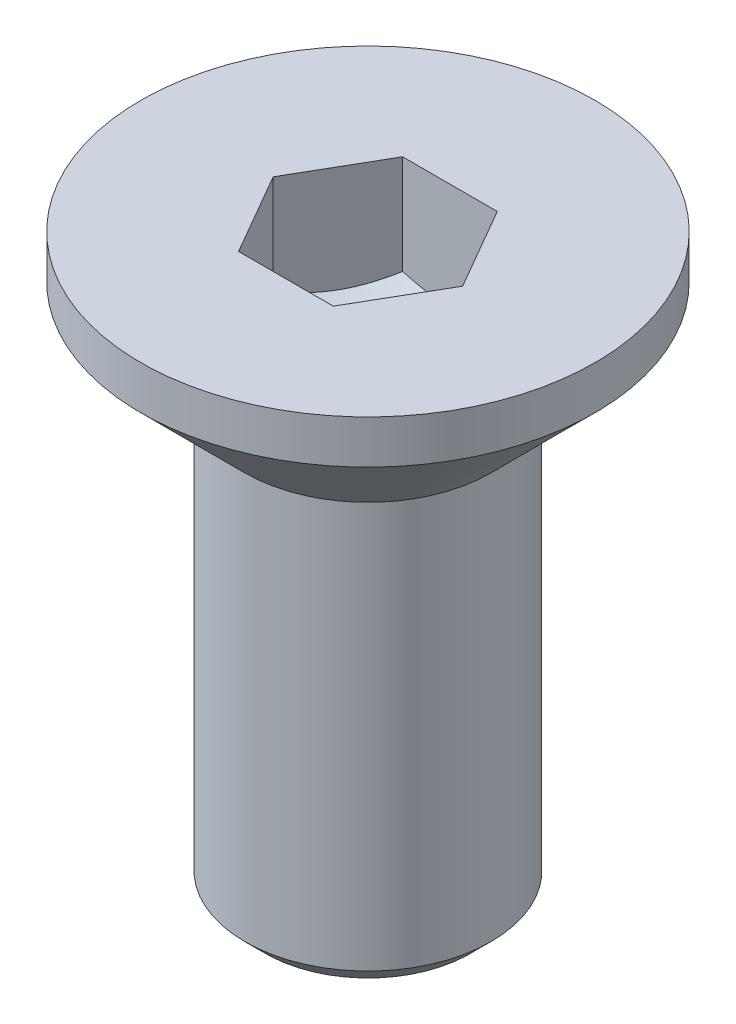
ISO-10303-21;
HEADER;
FILE_DESCRIPTION(('STEP AP214'),'2;1');
FILE_NAME('part.step','',(''),(''),'','','');
FILE_SCHEMA(('AUTOMOTIVE_DESIGN { 1 0 10303 214 1 1 1 1 }'));
ENDSEC;
DATA;
#1=APPLICATION_CONTEXT('core data for automotive mechanical design processes');
#2=APPLICATION_PROTOCOL_DEFINITION('international standard','automotive_design',2000,#1);
#3=PRODUCT_CONTEXT('',#1,'mechanical');
#4=PRODUCT('Part','Part','',(#3));
#5=PRODUCT_RELATED_PRODUCT_CATEGORY('part','',(#4));
#6=PRODUCT_DEFINITION_FORMATION('','',#4);
#7=PRODUCT_DEFINITION_CONTEXT('part definition',#1,'design');
#8=PRODUCT_DEFINITION('design','',#6,#7);
#9=PRODUCT_DEFINITION_SHAPE('','',#8);
#10=(LENGTH_UNIT() NAMED_UNIT(*) SI_UNIT(.MILLI.,.METRE.));
#11=(NAMED_UNIT(*) PLANE_ANGLE_UNIT() SI_UNIT($,.RADIAN.));
#12=(NAMED_UNIT(*) SI_UNIT($,.STERADIAN.) SOLID_ANGLE_UNIT());
#13=UNCERTAINTY_MEASURE_WITH_UNIT(LENGTH_MEASURE(1.E-05),#10,'distance_accuracy_value','');
#14=(GEOMETRIC_REPRESENTATION_CONTEXT(3) GLOBAL_UNCERTAINTY_ASSIGNED_CONTEXT((#13)) GLOBAL_UNIT_ASSIGNED_CONTEXT((#10,
#11,#12)) REPRESENTATION_CONTEXT('',''));
#15=CARTESIAN_POINT('',(0.,0.,0.));
#16=DIRECTION('',(0.,0.,1.));
#17=DIRECTION('',(1.,0.,0.));
#18=AXIS2_PLACEMENT_3D('',#15,#16,#17);
#19=CARTESIAN_POINT('',(0.,-1.8,0.));
#20=DIRECTION('',(0.,1.,0.));
#21=DIRECTION('',(0.,0.,1.));
#22=AXIS2_PLACEMENT_3D('',#19,#20,#21);
#23=CONICAL_SURFACE('',#22,1.5,0.785398163397443);
#24=CARTESIAN_POINT('',(0.,-0.529999999999987,0.));
#25=DIRECTION('',(0.,-1.,0.));
#26=DIRECTION('',(0.,0.,-1.));
#27=AXIS2_PLACEMENT_3D('',#24,#25,#26);
#28=CIRCLE('',#27,2.77);
#29=CARTESIAN_POINT('',(0.,-0.529999999999987,-2.77));
#30=VERTEX_POINT('',#29);
#31=EDGE_CURVE('E11',#30,#30,#28,.T.);
#32=ORIENTED_EDGE('',*,*,#31,.T.);
#33=EDGE_LOOP('',(#32));
#34=FACE_BOUND('',#33,.T.);
#35=CARTESIAN_POINT('',(0.,-1.8,0.));
#36=DIRECTION('',(0.,-1.,0.));
#37=DIRECTION('',(0.,0.,-1.));
#38=AXIS2_PLACEMENT_3D('',#35,#36,#37);
#39=CIRCLE('',#38,1.5);
#40=CARTESIAN_POINT('',(0.,-1.8,-1.5));
#41=VERTEX_POINT('',#40);
#42=EDGE_CURVE('E145',#41,#41,#39,.T.);
#43=ORIENTED_EDGE('',*,*,#42,.F.);
#44=EDGE_LOOP('',(#43));
#45=FACE_BOUND('',#44,.T.);
#46=ADVANCED_FACE('F37',(#34,#45),#23,.T.);
#47=CARTESIAN_POINT('',(0.,0.,0.));
#48=DIRECTION('',(0.,-1.,0.));
#49=DIRECTION('',(0.,0.,-1.));
#50=AXIS2_PLACEMENT_3D('',#47,#48,#49);
#51=CYLINDRICAL_SURFACE('',#50,2.77);
#52=CARTESIAN_POINT('',(0.,0.,0.));
#53=DIRECTION('',(0.,-1.,0.));
#54=DIRECTION('',(0.,0.,-1.));
#55=AXIS2_PLACEMENT_3D('',#52,#53,#54);
#56=CIRCLE('',#55,2.77);
#57=CARTESIAN_POINT('',(0.,0.,-2.77));
#58=VERTEX_POINT('',#57);
#59=EDGE_CURVE('E44',#58,#58,#56,.T.);
#60=ORIENTED_EDGE('',*,*,#59,.T.);
#61=EDGE_LOOP('',(#60));
#62=FACE_BOUND('',#61,.T.);
#63=ORIENTED_EDGE('',*,*,#31,.F.);
#64=EDGE_LOOP('',(#63));
#65=FACE_BOUND('',#64,.T.);
#66=ADVANCED_FACE('F212',(#62,#65),#51,.T.);
#67=CARTESIAN_POINT('',(1.,0.,0.));
#68=DIRECTION('',(0.,1.,0.));
#69=DIRECTION('',(0.,0.,1.));
#70=AXIS2_PLACEMENT_3D('',#67,#68,#69);
#71=PLANE('',#70);
#72=DIRECTION('',(0.5,0.,0.866025403784438));
#73=VECTOR('',#72,1.);
#74=CARTESIAN_POINT('',(-1.15470053837925,0.,0.));
#75=LINE('',#74,#73);
#76=CARTESIAN_POINT('',(-1.15470053837925,0.,0.));
#77=VERTEX_POINT('',#76);
#78=CARTESIAN_POINT('',(-0.577350269189625,0.,1.));
#79=VERTEX_POINT('',#78);
#80=EDGE_CURVE('E123',#77,#79,#75,.T.);
#81=ORIENTED_EDGE('',*,*,#80,.F.);
#82=DIRECTION('',(-0.5,0.,0.866025403784439));
#83=VECTOR('',#82,1.);
#84=CARTESIAN_POINT('',(-0.577350269189626,0.,-1.));
#85=LINE('',#84,#83);
#86=CARTESIAN_POINT('',(-0.577350269189626,0.,-1.));
#87=VERTEX_POINT('',#86);
#88=EDGE_CURVE('E118',#87,#77,#85,.T.);
#89=ORIENTED_EDGE('',*,*,#88,.F.);
#90=DIRECTION('',(-1.,0.,0.));
#91=VECTOR('',#90,1.);
#92=CARTESIAN_POINT('',(0.577350269189626,0.,-1.));
#93=LINE('',#92,#91);
#94=CARTESIAN_POINT('',(0.577350269189626,0.,-1.));
#95=VERTEX_POINT('',#94);
#96=EDGE_CURVE('E116',#95,#87,#93,.T.);
#97=ORIENTED_EDGE('',*,*,#96,.F.);
#98=DIRECTION('',(-0.5,0.,-0.866025403784439));
#99=VECTOR('',#98,1.);
#100=CARTESIAN_POINT('',(1.15470053837925,0.,0.));
#101=LINE('',#100,#99);
#102=CARTESIAN_POINT('',(1.15470053837925,0.,0.));
#103=VERTEX_POINT('',#102);
#104=EDGE_CURVE('E101',#103,#95,#101,.T.);
#105=ORIENTED_EDGE('',*,*,#104,.F.);
#106=DIRECTION('',(0.499999999999999,0.,-0.866025403784439));
#107=VECTOR('',#106,1.);
#108=CARTESIAN_POINT('',(0.577350269189626,0.,1.));
#109=LINE('',#108,#107);
#110=CARTESIAN_POINT('',(0.577350269189626,0.,1.));
#111=VERTEX_POINT('',#110);
#112=EDGE_CURVE('E93',#111,#103,#109,.T.);
#113=ORIENTED_EDGE('',*,*,#112,.F.);
#114=DIRECTION('',(1.,0.,0.));
#115=VECTOR('',#114,1.);
#116=CARTESIAN_POINT('',(-0.577350269189625,0.,1.));
#117=LINE('',#116,#115);
#118=EDGE_CURVE('E109',#79,#111,#117,.T.);
#119=ORIENTED_EDGE('',*,*,#118,.F.);
#120=EDGE_LOOP('',(#81,#89,#97,#105,#113,#119));
#121=FACE_BOUND('',#120,.T.);
#122=ORIENTED_EDGE('',*,*,#59,.F.);
#123=EDGE_LOOP('',(#122));
#124=FACE_BOUND('',#123,.T.);
#125=ADVANCED_FACE('F113',(#121,#124),#71,.T.);
#126=CARTESIAN_POINT('',(1.25,-7.,0.));
#127=DIRECTION('',(0.,-1.,0.));
#128=DIRECTION('',(0.,0.,-1.));
#129=AXIS2_PLACEMENT_3D('',#126,#127,#128);
#130=PLANE('',#129);
#131=CARTESIAN_POINT('',(0.,-7.,0.));
#132=DIRECTION('',(0.,-1.,0.));
#133=DIRECTION('',(0.,0.,-1.));
#134=AXIS2_PLACEMENT_3D('',#131,#132,#133);
#135=CIRCLE('',#134,1.25);
#136=CARTESIAN_POINT('',(0.,-7.,-1.25));
#137=VERTEX_POINT('',#136);
#138=EDGE_CURVE('E225',#137,#137,#135,.T.);
#139=ORIENTED_EDGE('',*,*,#138,.T.);
#140=EDGE_LOOP('',(#139));
#141=FACE_BOUND('',#140,.T.);
#142=ADVANCED_FACE('F155',(#141),#130,.T.);
#143=CARTESIAN_POINT('',(0.,-7.,0.));
#144=DIRECTION('',(0.,1.,0.));
#145=DIRECTION('',(0.,0.,1.));
#146=AXIS2_PLACEMENT_3D('',#143,#144,#145);
#147=CONICAL_SURFACE('',#146,1.25,0.785398163397425);
#148=CARTESIAN_POINT('',(0.,-6.74999999999999,0.));
#149=DIRECTION('',(0.,-1.,0.));
#150=DIRECTION('',(0.,0.,-1.));
#151=AXIS2_PLACEMENT_3D('',#148,#149,#150);
#152=CIRCLE('',#151,1.5);
#153=CARTESIAN_POINT('',(0.,-6.74999999999999,-1.5));
#154=VERTEX_POINT('',#153);
#155=EDGE_CURVE('E223',#154,#154,#152,.T.);
#156=ORIENTED_EDGE('',*,*,#155,.T.);
#157=EDGE_LOOP('',(#156));
#158=FACE_BOUND('',#157,.T.);
#159=ORIENTED_EDGE('',*,*,#138,.F.);
#160=EDGE_LOOP('',(#159));
#161=FACE_BOUND('',#160,.T.);
#162=ADVANCED_FACE('F237',(#158,#161),#147,.T.);
#163=CARTESIAN_POINT('',(0.,0.,0.));
#164=DIRECTION('',(0.,-1.,0.));
#165=DIRECTION('',(0.,0.,-1.));
#166=AXIS2_PLACEMENT_3D('',#163,#164,#165);
#167=CYLINDRICAL_SURFACE('',#166,1.5);
#168=ORIENTED_EDGE('',*,*,#42,.T.);
#169=EDGE_LOOP('',(#168));
#170=FACE_BOUND('',#169,.T.);
#171=ORIENTED_EDGE('',*,*,#155,.F.);
#172=EDGE_LOOP('',(#171));
#173=FACE_BOUND('',#172,.T.);
#174=ADVANCED_FACE('F242',(#170,#173),#167,.T.);
#175=CARTESIAN_POINT('',(0.577350269189626,-7.001,1.));
#176=DIRECTION('',(0.866025403784439,0.,0.499999999999999));
#177=DIRECTION('',(0.499999999999999,0.,-0.866025403784439));
#178=AXIS2_PLACEMENT_3D('',#175,#176,#177);
#179=PLANE('',#178);
#180=ORIENTED_EDGE('',*,*,#112,.T.);
#181=DIRECTION('',(0.,1.,0.));
#182=VECTOR('',#181,1.);
#183=CARTESIAN_POINT('',(1.15470053837925,-7.001,0.));
#184=LINE('',#183,#182);
#185=CARTESIAN_POINT('',(1.15470053837925,-1.21068360252296,0.));
#186=VERTEX_POINT('',#185);
#187=EDGE_CURVE('E96',#186,#103,#184,.T.);
#188=ORIENTED_EDGE('',*,*,#187,.F.);
#189=CARTESIAN_POINT('',(1.15481600843309,-1.21061692585729,-0.000200000000000855));
#190=CARTESIAN_POINT('',(1.12944301174833,-1.22527462887381,0.0437473193982791));
#191=CARTESIAN_POINT('',(1.10385100003722,-1.23860587890206,0.0880739839498195));
#192=CARTESIAN_POINT('',(1.05222370923805,-1.2618770948995,0.177495074671121));
#193=CARTESIAN_POINT('',(1.02618751195472,-1.27180882597318,0.22259109120173));
#194=CARTESIAN_POINT('',(0.97443782948051,-1.28727090764088,0.312224170522618));
#195=CARTESIAN_POINT('',(0.948732312346695,-1.29290413442401,0.356747432233219));
#196=CARTESIAN_POINT('',(0.897200159195207,-1.29963231388271,0.446003739715016));
#197=CARTESIAN_POINT('',(0.871373710819097,-1.3007328346013,0.490736460481493));
#198=CARTESIAN_POINT('',(0.823104543442188,-1.29845855022482,0.574341110817346));
#199=CARTESIAN_POINT('',(0.800654644281321,-1.29564216365955,0.613225476788766));
#200=CARTESIAN_POINT('',(0.755901125586785,-1.28671115230561,0.690740844985186));
#201=CARTESIAN_POINT('',(0.733597661157427,-1.28059346876866,0.729371578561639));
#202=CARTESIAN_POINT('',(0.688751668428419,-1.26529787679714,0.807047116484145));
#203=CARTESIAN_POINT('',(0.666214823887575,-1.256055050354,0.846082076271168));
#204=CARTESIAN_POINT('',(0.62147750748425,-1.23507675676743,0.923569381276012));
#205=CARTESIAN_POINT('',(0.599276461273705,-1.2233462273893,0.962022721293859));
#206=CARTESIAN_POINT('',(0.577234799135788,-1.21061692585729,1.0002));
#207=B_SPLINE_CURVE_WITH_KNOTS('',3,(#189,#190,#191,#192,#193,#194,#195,#196,#197,#198,#199,
#200,#201,#202,#203,#204,#205,#206),.UNSPECIFIED.,.F.,.F.,(4,2,2,2,2,2,2,2,4),(0.,
0.158523820030115,0.317428970089342,0.472400167924633,0.627180939971648,0.762016584872711,
0.896977373984233,1.03493410168667,1.17261952416172),.UNSPECIFIED.);
#208=CARTESIAN_POINT('',(0.577350269189626,-1.21068360252296,1.));
#209=VERTEX_POINT('',#208);
#210=EDGE_CURVE('E67',#186,#209,#207,.T.);
#211=ORIENTED_EDGE('',*,*,#210,.T.);
#212=DIRECTION('',(0.,1.,0.));
#213=VECTOR('',#212,1.);
#214=CARTESIAN_POINT('',(0.577350269189626,-7.001,1.));
#215=LINE('',#214,#213);
#216=EDGE_CURVE('E98',#209,#111,#215,.T.);
#217=ORIENTED_EDGE('',*,*,#216,.T.);
#218=EDGE_LOOP('',(#180,#188,#211,#217));
#219=FACE_BOUND('',#218,.T.);
#220=ADVANCED_FACE('F95',(#219),#179,.F.);
#221=CARTESIAN_POINT('',(-0.577350269189625,-7.001,1.));
#222=DIRECTION('',(0.,0.,1.));
#223=DIRECTION('',(1.,0.,0.));
#224=AXIS2_PLACEMENT_3D('',#221,#222,#223);
#225=PLANE('',#224);
#226=ORIENTED_EDGE('',*,*,#118,.T.);
#227=ORIENTED_EDGE('',*,*,#216,.F.);
#228=CARTESIAN_POINT('',(-1.55408177694847,-0.81039663548238,1.));
#229=CARTESIAN_POINT('',(-1.51034728455048,-0.831627015780123,1.));
#230=CARTESIAN_POINT('',(-1.46651313545923,-0.852651155515047,1.));
#231=CARTESIAN_POINT('',(-1.37859132572397,-0.894179915533605,1.));
#232=CARTESIAN_POINT('',(-1.33450362660445,-0.914684454272694,1.));
#233=CARTESIAN_POINT('',(-1.20132756002827,-0.975463528391166,1.));
#234=CARTESIAN_POINT('',(-1.11179175777278,-1.01477464452659,1.));
#235=CARTESIAN_POINT('',(-0.928236953077744,-1.09051067196145,1.));
#236=CARTESIAN_POINT('',(-0.83416495483072,-1.12680863584527,1.));
#237=CARTESIAN_POINT('',(-0.643636298724897,-1.19216949714764,1.));
#238=CARTESIAN_POINT('',(-0.547185690706457,-1.22124901234249,1.));
#239=CARTESIAN_POINT('',(-0.400614425394176,-1.25591765693271,1.));
#240=CARTESIAN_POINT('',(-0.35156270534538,-1.26596847196643,1.));
#241=CARTESIAN_POINT('',(-0.25284507865612,-1.28245559612777,1.));
#242=CARTESIAN_POINT('',(-0.203179241660136,-1.28889231134226,1.));
#243=CARTESIAN_POINT('',(-0.104129273835635,-1.29755626136234,1.));
#244=CARTESIAN_POINT('',(-0.054750015875383,-1.29983769423653,1.));
#245=CARTESIAN_POINT('',(0.0440225426327359,-1.30014569576442,1.));
#246=CARTESIAN_POINT('',(0.0934158438114364,-1.29817202648743,1.));
#247=CARTESIAN_POINT('',(0.211620374040509,-1.28852847455586,1.));
#248=CARTESIAN_POINT('',(0.280271704456355,-1.27889096501734,1.));
#249=CARTESIAN_POINT('',(0.416349281235089,-1.25306938315679,1.));
#250=CARTESIAN_POINT('',(0.483774084515772,-1.23687806240265,1.));
#251=CARTESIAN_POINT('',(0.584713856360924,-1.20877081550312,1.));
#252=CARTESIAN_POINT('',(0.618739822658639,-1.19861720001231,1.));
#253=CARTESIAN_POINT('',(0.68643838256789,-1.17725652450741,1.));
#254=CARTESIAN_POINT('',(0.720111174085744,-1.16605009385098,1.));
#255=CARTESIAN_POINT('',(0.787146382749935,-1.14275679654915,1.));
#256=CARTESIAN_POINT('',(0.820508817461405,-1.13066998007669,1.));
#257=CARTESIAN_POINT('',(0.886961170054492,-1.10575810160484,1.));
#258=CARTESIAN_POINT('',(0.920051049295753,-1.09293293692057,1.));
#259=CARTESIAN_POINT('',(1.03116027678203,-1.0486819751619,1.));
#260=CARTESIAN_POINT('',(1.10861844731729,-1.015847812846,1.));
#261=CARTESIAN_POINT('',(1.26253919369019,-0.947913627092499,1.));
#262=CARTESIAN_POINT('',(1.33900154189392,-0.912813096145485,1.));
#263=CARTESIAN_POINT('',(1.49123178649972,-0.841035899062948,1.));
#264=CARTESIAN_POINT('',(1.56699927557996,-0.804358372242029,1.));
#265=CARTESIAN_POINT('',(1.71798920212848,-0.729895566963205,1.));
#266=CARTESIAN_POINT('',(1.79321161667367,-0.692110242250254,1.));
#267=CARTESIAN_POINT('',(2.01861545006398,-0.577387196822899,1.));
#268=CARTESIAN_POINT('',(2.16818530921483,-0.499250401556699,1.));
#269=CARTESIAN_POINT('',(2.46630722470024,-0.341202320975086,1.));
#270=CARTESIAN_POINT('',(2.61485962906834,-0.261291686632291,1.));
#271=CARTESIAN_POINT('',(2.88963218724699,-0.112118538195183,1.));
#272=CARTESIAN_POINT('',(3.01593641644803,-0.0430107332073649,1.));
#273=CARTESIAN_POINT('',(3.268237296676,0.0957957718283663,1.));
#274=CARTESIAN_POINT('',(3.39423391250616,0.165494535755019,0.999999999999999));
#275=CARTESIAN_POINT('',(3.64546316050959,0.305020300840114,0.999999999999999));
#276=CARTESIAN_POINT('',(3.77069677738669,0.374845530413005,0.999999999999999));
#277=CARTESIAN_POINT('',(4.02096993246976,0.514807855044461,0.999999999999999));
#278=CARTESIAN_POINT('',(4.14600949217417,0.584944911648917,0.999999999999999));
#279=CARTESIAN_POINT('',(4.27098636363414,0.655192887293507,0.999999999999999));
#280=B_SPLINE_CURVE_WITH_KNOTS('',3,(#228,#229,#230,#231,#232,#233,#234,#235,#236,#237,#238,
#239,#240,#241,#242,#243,#244,#245,#246,#247,#248,#249,#250,#251,#252,#253,#254,#255,#256,#257,
#258,#259,#260,#261,#262,#263,#264,#265,#266,#267,#268,#269,#270,#271,#272,#273,#274,#275,#276,
#277,#278,#279),.UNSPECIFIED.,.F.,.F.,(4,2,2,2,2,2,2,2,2,2,2,2,2,2,2,2,2,2,2,2,2,2,2,2,2,4),(0.,
0.145843400403702,0.291709549014357,0.584997711369502,0.887361111086853,1.1890218385339,
1.33912573885304,1.48921276984689,1.63732777401847,1.78545106048621,1.99300107545007,
2.20078126805557,2.3072939465958,2.41374335370193,2.5201866990266,2.62664488376187,
2.87896976301731,3.13135134283668,3.38387245957678,3.63640413515443,4.14262688755447,
4.64866683856263,5.08058792653353,5.51255631312772,5.94270831334742,6.37280866291134),.UNSPECIFIED.);
#281=CARTESIAN_POINT('',(-0.577350269189625,-1.21068360252296,1.));
#282=VERTEX_POINT('',#281);
#283=EDGE_CURVE('E182',#209,#282,#280,.F.);
#284=ORIENTED_EDGE('',*,*,#283,.T.);
#285=DIRECTION('',(0.,1.,0.));
#286=VECTOR('',#285,1.);
#287=CARTESIAN_POINT('',(-0.577350269189625,-7.001,1.));
#288=LINE('',#287,#286);
#289=EDGE_CURVE('E128',#282,#79,#288,.T.);
#290=ORIENTED_EDGE('',*,*,#289,.T.);
#291=EDGE_LOOP('',(#226,#227,#284,#290));
#292=FACE_BOUND('',#291,.T.);
#293=ADVANCED_FACE('F192',(#292),#225,.F.);
#294=CARTESIAN_POINT('',(-1.15470053837925,-7.001,0.));
#295=DIRECTION('',(-0.866025403784438,0.,0.5));
#296=DIRECTION('',(0.5,0.,0.866025403784438));
#297=AXIS2_PLACEMENT_3D('',#294,#295,#296);
#298=PLANE('',#297);
#299=ORIENTED_EDGE('',*,*,#80,.T.);
#300=ORIENTED_EDGE('',*,*,#289,.F.);
#301=CARTESIAN_POINT('',(-0.577234799135787,-1.21061692585729,1.0002));
#302=CARTESIAN_POINT('',(-0.602607795820546,-1.22527462887381,0.956252680601721));
#303=CARTESIAN_POINT('',(-0.628199807531656,-1.23860587890206,0.91192601605018));
#304=CARTESIAN_POINT('',(-0.67982709833083,-1.2618770948995,0.822504925328879));
#305=CARTESIAN_POINT('',(-0.705863295614157,-1.27180882597318,0.77740890879827));
#306=CARTESIAN_POINT('',(-0.757612978088366,-1.28727090764088,0.687775829477382));
#307=CARTESIAN_POINT('',(-0.783318495222182,-1.29290413442401,0.643252567766782));
#308=CARTESIAN_POINT('',(-0.83485064837367,-1.29963231388271,0.553996260284984));
#309=CARTESIAN_POINT('',(-0.86067709674978,-1.3007328346013,0.509263539518506));
#310=CARTESIAN_POINT('',(-0.908946264126689,-1.29845855022482,0.425658889182654));
#311=CARTESIAN_POINT('',(-0.931396163287556,-1.29564216365955,0.386774523211235));
#312=CARTESIAN_POINT('',(-0.976149681982092,-1.28671115230561,0.309259155014814));
#313=CARTESIAN_POINT('',(-0.99845314641145,-1.28059346876866,0.270628421438361));
#314=CARTESIAN_POINT('',(-1.04329913914046,-1.26529787679714,0.192952883515855));
#315=CARTESIAN_POINT('',(-1.0658359836813,-1.256055050354,0.153917923728833));
#316=CARTESIAN_POINT('',(-1.11057330008463,-1.23507675676743,0.0764306187239884));
#317=CARTESIAN_POINT('',(-1.13277434629517,-1.2233462273893,0.0379772787061412));
#318=CARTESIAN_POINT('',(-1.15481600843309,-1.21061692585729,-0.000199999999999493));
#319=B_SPLINE_CURVE_WITH_KNOTS('',3,(#301,#302,#303,#304,#305,#306,#307,#308,#309,#310,#311,
#312,#313,#314,#315,#316,#317,#318),.UNSPECIFIED.,.F.,.F.,(4,2,2,2,2,2,2,2,4),(0.,
0.158523820030115,0.317428970089342,0.472400167924633,0.627180939971648,0.762016584872711,
0.896977373984233,1.03493410168667,1.17261952416172),.UNSPECIFIED.);
#320=CARTESIAN_POINT('',(-1.15470053837925,-1.21068360252296,0.));
#321=VERTEX_POINT('',#320);
#322=EDGE_CURVE('E175',#282,#321,#319,.T.);
#323=ORIENTED_EDGE('',*,*,#322,.T.);
#324=DIRECTION('',(0.,1.,0.));
#325=VECTOR('',#324,1.);
#326=CARTESIAN_POINT('',(-1.15470053837925,-7.001,0.));
#327=LINE('',#326,#325);
#328=EDGE_CURVE('E131',#321,#77,#327,.T.);
#329=ORIENTED_EDGE('',*,*,#328,.T.);
#330=EDGE_LOOP('',(#299,#300,#323,#329));
#331=FACE_BOUND('',#330,.T.);
#332=ADVANCED_FACE('F195',(#331),#298,.F.);
#333=CARTESIAN_POINT('',(-0.577350269189626,-7.001,-1.));
#334=DIRECTION('',(-0.866025403784439,0.,-0.5));
#335=DIRECTION('',(-0.5,0.,0.866025403784439));
#336=AXIS2_PLACEMENT_3D('',#333,#334,#335);
#337=PLANE('',#336);
#338=ORIENTED_EDGE('',*,*,#88,.T.);
#339=ORIENTED_EDGE('',*,*,#328,.F.);
#340=CARTESIAN_POINT('',(-1.15481600843309,-1.21061692585729,0.000200000000000422));
#341=CARTESIAN_POINT('',(-1.12944301174833,-1.22527462887381,-0.0437473193982795));
#342=CARTESIAN_POINT('',(-1.10385100003722,-1.23860587890206,-0.08807398394982));
#343=CARTESIAN_POINT('',(-1.05222370923805,-1.2618770948995,-0.177495074671122));
#344=CARTESIAN_POINT('',(-1.02618751195472,-1.27180882597318,-0.222591091201731));
#345=CARTESIAN_POINT('',(-0.97443782948051,-1.28727090764088,-0.312224170522618));
#346=CARTESIAN_POINT('',(-0.948732312346695,-1.29290413442401,-0.356747432233219));
#347=CARTESIAN_POINT('',(-0.897200159195206,-1.29963231388271,-0.446003739715017));
#348=CARTESIAN_POINT('',(-0.871373710819097,-1.3007328346013,-0.490736460481494));
#349=CARTESIAN_POINT('',(-0.823104543442188,-1.29845855022482,-0.574341110817346));
#350=CARTESIAN_POINT('',(-0.800654644281321,-1.29564216365955,-0.613225476788766));
#351=CARTESIAN_POINT('',(-0.755901125586785,-1.28671115230561,-0.690740844985186));
#352=CARTESIAN_POINT('',(-0.733597661157427,-1.28059346876866,-0.729371578561639));
#353=CARTESIAN_POINT('',(-0.688751668428419,-1.26529787679714,-0.807047116484145));
#354=CARTESIAN_POINT('',(-0.666214823887576,-1.256055050354,-0.846082076271167));
#355=CARTESIAN_POINT('',(-0.62147750748425,-1.23507675676743,-0.923569381276012));
#356=CARTESIAN_POINT('',(-0.599276461273706,-1.2233462273893,-0.962022721293859));
#357=CARTESIAN_POINT('',(-0.577234799135788,-1.21061692585729,-1.0002));
#358=B_SPLINE_CURVE_WITH_KNOTS('',3,(#340,#341,#342,#343,#344,#345,#346,#347,#348,#349,#350,
#351,#352,#353,#354,#355,#356,#357),.UNSPECIFIED.,.F.,.F.,(4,2,2,2,2,2,2,2,4),(0.,
0.158523820030115,0.317428970089342,0.472400167924633,0.627180939971648,0.76201658487271,
0.896977373984232,1.03493410168667,1.17261952416172),.UNSPECIFIED.);
#359=CARTESIAN_POINT('',(-0.57735026918976,-1.21068360252305,-1.));
#360=VERTEX_POINT('',#359);
#361=EDGE_CURVE('E168',#321,#360,#358,.T.);
#362=ORIENTED_EDGE('',*,*,#361,.T.);
#363=DIRECTION('',(0.,1.,0.));
#364=VECTOR('',#363,1.);
#365=CARTESIAN_POINT('',(-0.577350269189626,-7.001,-1.));
#366=LINE('',#365,#364);
#367=EDGE_CURVE('E134',#360,#87,#366,.T.);
#368=ORIENTED_EDGE('',*,*,#367,.T.);
#369=EDGE_LOOP('',(#338,#339,#362,#368));
#370=FACE_BOUND('',#369,.T.);
#371=ADVANCED_FACE('F199',(#370),#337,.F.);
#372=CARTESIAN_POINT('',(0.577350269189626,-7.001,-1.));
#373=DIRECTION('',(0.,0.,-1.));
#374=DIRECTION('',(-1.,0.,0.));
#375=AXIS2_PLACEMENT_3D('',#372,#373,#374);
#376=PLANE('',#375);
#377=ORIENTED_EDGE('',*,*,#96,.T.);
#378=ORIENTED_EDGE('',*,*,#367,.F.);
#379=CARTESIAN_POINT('',(-1.55408177688798,-0.810396635511747,-1.));
#380=CARTESIAN_POINT('',(-1.51034728449204,-0.831627015808256,-1.));
#381=CARTESIAN_POINT('',(-1.46651313540283,-0.852651155541948,-1.));
#382=CARTESIAN_POINT('',(-1.37859132567167,-0.894179915558048,-1.));
#383=CARTESIAN_POINT('',(-1.33450362655419,-0.91468445429591,-1.));
#384=CARTESIAN_POINT('',(-1.20132755998423,-0.975463528410695,-1.));
#385=CARTESIAN_POINT('',(-1.11179175773291,-1.01477464454368,-1.));
#386=CARTESIAN_POINT('',(-0.928236953046536,-1.09051067197367,-1.));
#387=CARTESIAN_POINT('',(-0.834164954804002,-1.12680863585507,-1.));
#388=CARTESIAN_POINT('',(-0.643636298707345,-1.19216949715303,-1.));
#389=CARTESIAN_POINT('',(-0.547185690693583,-1.22124901234588,-1.));
#390=CARTESIAN_POINT('',(-0.400614425389716,-1.2559176569336,-1.));
#391=CARTESIAN_POINT('',(-0.351562705344562,-1.26596847196649,-1.));
#392=CARTESIAN_POINT('',(-0.252845078662673,-1.28245559612675,-1.));
#393=CARTESIAN_POINT('',(-0.203179241670417,-1.28889231134097,-1.));
#394=CARTESIAN_POINT('',(-0.104129273853313,-1.29755626136118,-1.));
#395=CARTESIAN_POINT('',(-0.0547500158967292,-1.29983769423575,-1.));
#396=CARTESIAN_POINT('',(0.0440225426041117,-1.30014569576504,-1.));
#397=CARTESIAN_POINT('',(0.0934158437792023,-1.29817202648908,-1.));
#398=CARTESIAN_POINT('',(0.211620374002709,-1.28852847456032,-1.));
#399=CARTESIAN_POINT('',(0.280271704416634,-1.27889096502351,-1.));
#400=CARTESIAN_POINT('',(0.416349281191665,-1.25306938316641,-1.));
#401=CARTESIAN_POINT('',(0.483774084470566,-1.23687806241402,-1.));
#402=CARTESIAN_POINT('',(0.584713856313039,-1.20877081551708,-1.));
#403=CARTESIAN_POINT('',(0.618739822609834,-1.19861720002713,-1.));
#404=CARTESIAN_POINT('',(0.686438382517256,-1.17725652452396,-1.));
#405=CARTESIAN_POINT('',(0.720111174034202,-1.16605009386837,-1.));
#406=CARTESIAN_POINT('',(0.787146382696581,-1.14275679656821,-1.));
#407=CARTESIAN_POINT('',(0.820508817407148,-1.13066998009656,-1.));
#408=CARTESIAN_POINT('',(0.886961169998429,-1.10575810162632,-1.));
#409=CARTESIAN_POINT('',(0.920051049238787,-1.09293293694284,-1.));
#410=CARTESIAN_POINT('',(1.03116027671957,-1.04868197518777,-1.));
#411=CARTESIAN_POINT('',(1.10861844725027,-1.01584781287472,-1.));
#412=CARTESIAN_POINT('',(1.26253919361409,-0.947913627126935,-1.));
#413=CARTESIAN_POINT('',(1.33900154181329,-0.91281309618278,-1.));
#414=CARTESIAN_POINT('',(1.49123178641005,-0.841035899105947,-1.));
#415=CARTESIAN_POINT('',(1.56699927548578,-0.804358372287871,-1.));
#416=CARTESIAN_POINT('',(1.71798920202526,-0.729895567014714,-1.));
#417=CARTESIAN_POINT('',(1.79321161656593,-0.692110242304585,-1.));
#418=CARTESIAN_POINT('',(2.01861544994268,-0.577387196885664,-1.));
#419=CARTESIAN_POINT('',(2.16818530908449,-0.499250401625042,-1.));
#420=CARTESIAN_POINT('',(2.46630722455179,-0.341202321054522,-1.));
#421=CARTESIAN_POINT('',(2.61485962891082,-0.261291686717242,-1.));
#422=CARTESIAN_POINT('',(2.88963218707329,-0.112118538289965,-1.));
#423=CARTESIAN_POINT('',(3.01593641626721,-0.0430107333064634,-1.));
#424=CARTESIAN_POINT('',(3.26823729648093,0.0957957717206634,-1.));
#425=CARTESIAN_POINT('',(3.39423391230395,0.16549453564303,-1.));
#426=CARTESIAN_POINT('',(3.64546316029308,0.305020300719556,-1.));
#427=CARTESIAN_POINT('',(3.77069677716299,0.374845530288166,-1.));
#428=CARTESIAN_POINT('',(4.02096993223169,0.514807854911075,-1.));
#429=CARTESIAN_POINT('',(4.14600949192892,0.584944911511267,-1.));
#430=CARTESIAN_POINT('',(4.2709863633817,0.655192887151598,-1.));
#431=B_SPLINE_CURVE_WITH_KNOTS('',3,(#379,#380,#381,#382,#383,#384,#385,#386,#387,#388,#389,
#390,#391,#392,#393,#394,#395,#396,#397,#398,#399,#400,#401,#402,#403,#404,#405,#406,#407,#408,
#409,#410,#411,#412,#413,#414,#415,#416,#417,#418,#419,#420,#421,#422,#423,#424,#425,#426,#427,
#428,#429,#430),.UNSPECIFIED.,.F.,.F.,(4,2,2,2,2,2,2,2,2,2,2,2,2,2,2,2,2,2,2,2,2,2,2,2,2,4),(0.,
0.145843400396574,0.2917095490001,0.584997711340831,0.88736111104301,1.18902183847495,
1.33912573878291,1.48921276976561,1.63732777392629,1.78545106038312,1.99300107534057,
2.20078126793964,2.30729394647648,2.41374335357922,2.52018669890051,2.62664488363239,
2.8789697628719,3.13135134267535,3.38387245939954,3.63640413496127,4.14262688732952,
4.64866683830588,5.08058792625182,5.51255631282107,5.9427083130157,6.37280866255456),.UNSPECIFIED.);
#432=CARTESIAN_POINT('',(0.577350269189626,-1.21068360252296,-1.));
#433=VERTEX_POINT('',#432);
#434=EDGE_CURVE('E55',#360,#433,#431,.T.);
#435=ORIENTED_EDGE('',*,*,#434,.T.);
#436=DIRECTION('',(0.,1.,0.));
#437=VECTOR('',#436,1.);
#438=CARTESIAN_POINT('',(0.577350269189626,-7.001,-1.));
#439=LINE('',#438,#437);
#440=EDGE_CURVE('E108',#433,#95,#439,.T.);
#441=ORIENTED_EDGE('',*,*,#440,.T.);
#442=EDGE_LOOP('',(#377,#378,#435,#441));
#443=FACE_BOUND('',#442,.T.);
#444=ADVANCED_FACE('F203',(#443),#376,.F.);
#445=CARTESIAN_POINT('',(1.15470053837925,-7.001,0.));
#446=DIRECTION('',(0.866025403784439,0.,-0.5));
#447=DIRECTION('',(-0.5,0.,-0.866025403784439));
#448=AXIS2_PLACEMENT_3D('',#445,#446,#447);
#449=PLANE('',#448);
#450=ORIENTED_EDGE('',*,*,#104,.T.);
#451=ORIENTED_EDGE('',*,*,#440,.F.);
#452=CARTESIAN_POINT('',(0.577234799135788,-1.21061692585729,-1.0002));
#453=CARTESIAN_POINT('',(0.602607795820547,-1.22527462887381,-0.95625268060172));
#454=CARTESIAN_POINT('',(0.628199807531657,-1.23860587890206,-0.91192601605018));
#455=CARTESIAN_POINT('',(0.679827098330831,-1.2618770948995,-0.822504925328878));
#456=CARTESIAN_POINT('',(0.705863295614158,-1.27180882597318,-0.777408908798269));
#457=CARTESIAN_POINT('',(0.757612978088367,-1.28727090764088,-0.687775829477381));
#458=CARTESIAN_POINT('',(0.783318495222183,-1.29290413442401,-0.643252567766781));
#459=CARTESIAN_POINT('',(0.834850648373671,-1.29963231388271,-0.553996260284983));
#460=CARTESIAN_POINT('',(0.860677096749781,-1.3007328346013,-0.509263539518506));
#461=CARTESIAN_POINT('',(0.908946264126689,-1.29845855022482,-0.425658889182654));
#462=CARTESIAN_POINT('',(0.931396163287557,-1.29564216365955,-0.386774523211234));
#463=CARTESIAN_POINT('',(0.976149681982093,-1.28671115230561,-0.309259155014814));
#464=CARTESIAN_POINT('',(0.99845314641145,-1.28059346876866,-0.270628421438361));
#465=CARTESIAN_POINT('',(1.04329913914046,-1.26529787679714,-0.192952883515856));
#466=CARTESIAN_POINT('',(1.0658359836813,-1.256055050354,-0.153917923728833));
#467=CARTESIAN_POINT('',(1.11057330008463,-1.23507675676743,-0.0764306187239887));
#468=CARTESIAN_POINT('',(1.13277434629517,-1.2233462273893,-0.0379772787061416));
#469=CARTESIAN_POINT('',(1.15481600843309,-1.21061692585729,0.000199999999999103));
#470=B_SPLINE_CURVE_WITH_KNOTS('',3,(#452,#453,#454,#455,#456,#457,#458,#459,#460,#461,#462,
#463,#464,#465,#466,#467,#468,#469),.UNSPECIFIED.,.F.,.F.,(4,2,2,2,2,2,2,2,4),(0.,
0.158523820030116,0.317428970089343,0.472400167924634,0.627180939971648,0.762016584872711,
0.896977373984232,1.03493410168667,1.17261952416172),.UNSPECIFIED.);
#471=EDGE_CURVE('E107',#433,#186,#470,.T.);
#472=ORIENTED_EDGE('',*,*,#471,.T.);
#473=ORIENTED_EDGE('',*,*,#187,.T.);
#474=EDGE_LOOP('',(#450,#451,#472,#473));
#475=FACE_BOUND('',#474,.T.);
#476=ADVANCED_FACE('F104',(#475),#449,.F.);
#477=CARTESIAN_POINT('',(0.,-1.3,0.));
#478=DIRECTION('',(0.,1.,0.));
#479=DIRECTION('',(0.,0.,1.));
#480=AXIS2_PLACEMENT_3D('',#477,#478,#479);
#481=CONICAL_SURFACE('',#480,1.,1.0471975511966);
#482=CARTESIAN_POINT('',(0.,-1.87735026918962,0.));
#483=VERTEX_POINT('',#482);
#484=VERTEX_LOOP('',#483);
#485=FACE_BOUND('',#484,.T.);
#486=ORIENTED_EDGE('',*,*,#322,.F.);
#487=ORIENTED_EDGE('',*,*,#283,.F.);
#488=ORIENTED_EDGE('',*,*,#210,.F.);
#489=ORIENTED_EDGE('',*,*,#471,.F.);
#490=ORIENTED_EDGE('',*,*,#434,.F.);
#491=ORIENTED_EDGE('',*,*,#361,.F.);
#492=EDGE_LOOP('',(#486,#487,#488,#489,#490,#491));
#493=FACE_BOUND('',#492,.T.);
#494=ADVANCED_FACE('F150',(#485,#493),#481,.F.);
#495=CLOSED_SHELL('',(#46,#66,#125,#142,#162,#174,#220,#293,#332,#371,#444,#476,#494));
#496=MANIFOLD_SOLID_BREP('B2',#495);
#497=ADVANCED_BREP_SHAPE_REPRESENTATION('',(#18,#496),#14);
#498=SHAPE_DEFINITION_REPRESENTATION(#9,#497);
ENDSEC;
END-ISO-10303-21;
